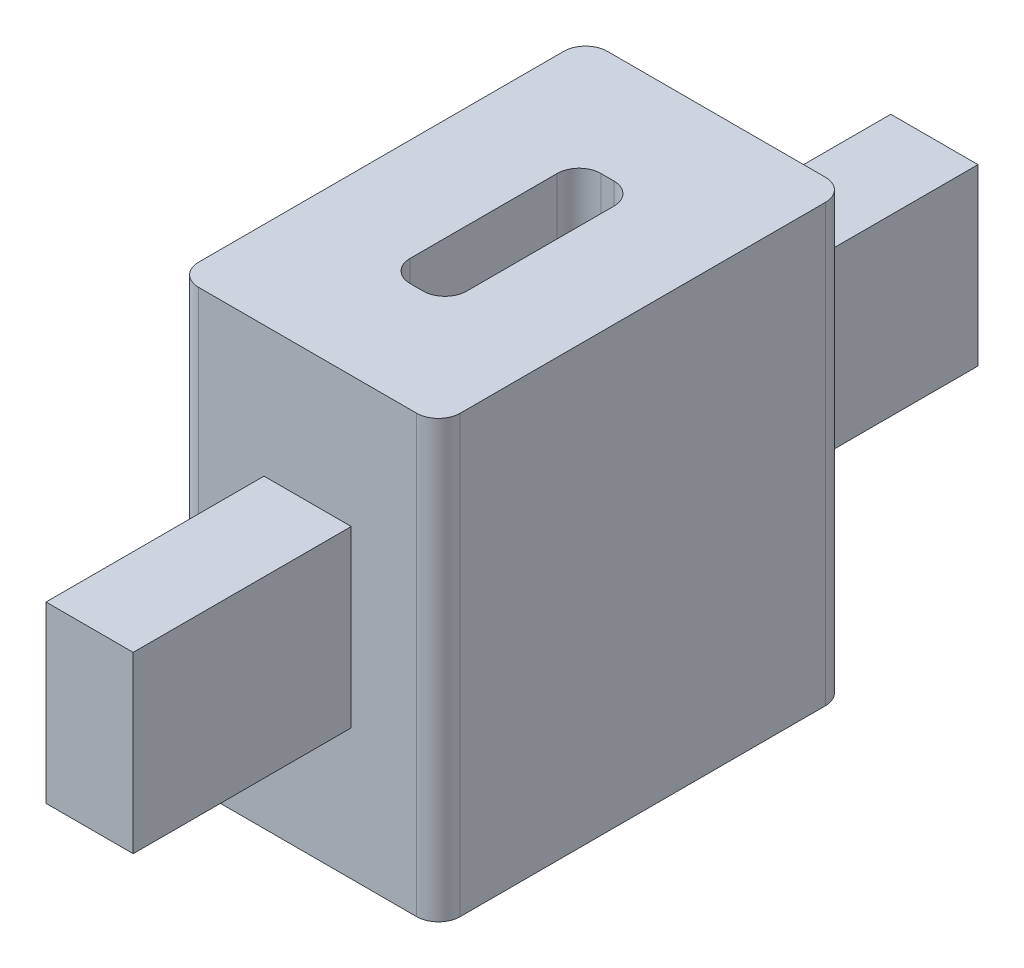
ISO-10303-21;
HEADER;
FILE_DESCRIPTION(('STEP AP214'),'2;1');
FILE_NAME('part.step','',(''),(''),'','','');
FILE_SCHEMA(('AUTOMOTIVE_DESIGN { 1 0 10303 214 1 1 1 1 }'));
ENDSEC;
DATA;
#1=APPLICATION_CONTEXT('core data for automotive mechanical design processes');
#2=APPLICATION_PROTOCOL_DEFINITION('international standard','automotive_design',2000,#1);
#3=PRODUCT_CONTEXT('',#1,'mechanical');
#4=PRODUCT('Part','Part','',(#3));
#5=PRODUCT_RELATED_PRODUCT_CATEGORY('part','',(#4));
#6=PRODUCT_DEFINITION_FORMATION('','',#4);
#7=PRODUCT_DEFINITION_CONTEXT('part definition',#1,'design');
#8=PRODUCT_DEFINITION('design','',#6,#7);
#9=PRODUCT_DEFINITION_SHAPE('','',#8);
#10=(LENGTH_UNIT() NAMED_UNIT(*) SI_UNIT(.MILLI.,.METRE.));
#11=(NAMED_UNIT(*) PLANE_ANGLE_UNIT() SI_UNIT($,.RADIAN.));
#12=(NAMED_UNIT(*) SI_UNIT($,.STERADIAN.) SOLID_ANGLE_UNIT());
#13=UNCERTAINTY_MEASURE_WITH_UNIT(LENGTH_MEASURE(1.E-05),#10,'distance_accuracy_value','');
#14=(GEOMETRIC_REPRESENTATION_CONTEXT(3) GLOBAL_UNCERTAINTY_ASSIGNED_CONTEXT((#13)) GLOBAL_UNIT_ASSIGNED_CONTEXT((#10,
#11,#12)) REPRESENTATION_CONTEXT('',''));
#15=CARTESIAN_POINT('',(0.,0.,0.));
#16=DIRECTION('',(0.,0.,1.));
#17=DIRECTION('',(1.,0.,0.));
#18=AXIS2_PLACEMENT_3D('',#15,#16,#17);
#19=CARTESIAN_POINT('',(-15.24,50.8,23.8125));
#20=DIRECTION('',(0.,0.,-1.));
#21=DIRECTION('',(-1.,0.,0.));
#22=AXIS2_PLACEMENT_3D('',#19,#20,#21);
#23=PLANE('',#22);
#24=DIRECTION('',(1.,0.,0.));
#25=VECTOR('',#24,1.);
#26=CARTESIAN_POINT('',(-15.24,0.,23.8125));
#27=LINE('',#26,#25);
#28=CARTESIAN_POINT('',(-12.7,0.,23.8125));
#29=VERTEX_POINT('',#28);
#30=CARTESIAN_POINT('',(12.7,0.,23.8125));
#31=VERTEX_POINT('',#30);
#32=EDGE_CURVE('E282',#29,#31,#27,.T.);
#33=ORIENTED_EDGE('',*,*,#32,.T.);
#34=DIRECTION('',(0.,-1.,0.));
#35=VECTOR('',#34,1.);
#36=CARTESIAN_POINT('',(12.7,50.8,23.8125));
#37=LINE('',#36,#35);
#38=CARTESIAN_POINT('',(12.7,50.8,23.8125));
#39=VERTEX_POINT('',#38);
#40=EDGE_CURVE('E353',#31,#39,#37,.F.);
#41=ORIENTED_EDGE('',*,*,#40,.T.);
#42=DIRECTION('',(1.,0.,0.));
#43=VECTOR('',#42,1.);
#44=CARTESIAN_POINT('',(-15.24,50.8,23.8125));
#45=LINE('',#44,#43);
#46=CARTESIAN_POINT('',(-12.7,50.8,23.8125));
#47=VERTEX_POINT('',#46);
#48=EDGE_CURVE('E288',#47,#39,#45,.T.);
#49=ORIENTED_EDGE('',*,*,#48,.F.);
#50=DIRECTION('',(0.,-1.,0.));
#51=VECTOR('',#50,1.);
#52=CARTESIAN_POINT('',(-12.7,50.8,23.8125));
#53=LINE('',#52,#51);
#54=EDGE_CURVE('E350',#47,#29,#53,.T.);
#55=ORIENTED_EDGE('',*,*,#54,.T.);
#56=EDGE_LOOP('',(#33,#41,#49,#55));
#57=FACE_BOUND('',#56,.T.);
#58=DIRECTION('',(0.,1.,0.));
#59=VECTOR('',#58,1.);
#60=CARTESIAN_POINT('',(5.08,35.56,23.8125));
#61=LINE('',#60,#59);
#62=CARTESIAN_POINT('',(5.08,15.24,23.8125));
#63=VERTEX_POINT('',#62);
#64=CARTESIAN_POINT('',(5.08,35.56,23.8125));
#65=VERTEX_POINT('',#64);
#66=EDGE_CURVE('E215',#63,#65,#61,.T.);
#67=ORIENTED_EDGE('',*,*,#66,.F.);
#68=DIRECTION('',(1.,0.,0.));
#69=VECTOR('',#68,1.);
#70=CARTESIAN_POINT('',(-5.08,15.24,23.8125));
#71=LINE('',#70,#69);
#72=CARTESIAN_POINT('',(-5.08,15.24,23.8125));
#73=VERTEX_POINT('',#72);
#74=EDGE_CURVE('E212',#73,#63,#71,.T.);
#75=ORIENTED_EDGE('',*,*,#74,.F.);
#76=DIRECTION('',(0.,-1.,0.));
#77=VECTOR('',#76,1.);
#78=CARTESIAN_POINT('',(-5.08,35.56,23.8125));
#79=LINE('',#78,#77);
#80=CARTESIAN_POINT('',(-5.08,35.56,23.8125));
#81=VERTEX_POINT('',#80);
#82=EDGE_CURVE('E55',#81,#73,#79,.T.);
#83=ORIENTED_EDGE('',*,*,#82,.F.);
#84=DIRECTION('',(-1.,0.,0.));
#85=VECTOR('',#84,1.);
#86=CARTESIAN_POINT('',(-5.08,35.56,23.8125));
#87=LINE('',#86,#85);
#88=EDGE_CURVE('E50',#65,#81,#87,.T.);
#89=ORIENTED_EDGE('',*,*,#88,.F.);
#90=EDGE_LOOP('',(#67,#75,#83,#89));
#91=FACE_BOUND('',#90,.T.);
#92=ADVANCED_FACE('F35',(#57,#91),#23,.F.);
#93=CARTESIAN_POINT('',(0.,50.8,0.));
#94=DIRECTION('',(0.,-1.,0.));
#95=DIRECTION('',(0.,0.,-1.));
#96=AXIS2_PLACEMENT_3D('',#93,#94,#95);
#97=PLANE('',#96);
#98=ORIENTED_EDGE('',*,*,#48,.T.);
#99=CARTESIAN_POINT('',(12.7,50.8,21.2725));
#100=DIRECTION('',(0.,-1.,0.));
#101=DIRECTION('',(0.,0.,-1.));
#102=AXIS2_PLACEMENT_3D('',#99,#100,#101);
#103=CIRCLE('',#102,2.54);
#104=CARTESIAN_POINT('',(15.24,50.8,21.2725));
#105=VERTEX_POINT('',#104);
#106=EDGE_CURVE('E361',#39,#105,#103,.F.);
#107=ORIENTED_EDGE('',*,*,#106,.T.);
#108=DIRECTION('',(0.,0.,-1.));
#109=VECTOR('',#108,1.);
#110=CARTESIAN_POINT('',(15.24,50.8,23.8125));
#111=LINE('',#110,#109);
#112=CARTESIAN_POINT('',(15.24,50.8,-21.2725));
#113=VERTEX_POINT('',#112);
#114=EDGE_CURVE('E278',#105,#113,#111,.T.);
#115=ORIENTED_EDGE('',*,*,#114,.T.);
#116=CARTESIAN_POINT('',(12.7,50.8,-21.2725));
#117=DIRECTION('',(0.,-1.,0.));
#118=DIRECTION('',(0.,0.,-1.));
#119=AXIS2_PLACEMENT_3D('',#116,#117,#118);
#120=CIRCLE('',#119,2.54);
#121=CARTESIAN_POINT('',(12.7,50.8,-23.8125));
#122=VERTEX_POINT('',#121);
#123=EDGE_CURVE('E359',#113,#122,#120,.F.);
#124=ORIENTED_EDGE('',*,*,#123,.T.);
#125=DIRECTION('',(-1.,0.,0.));
#126=VECTOR('',#125,1.);
#127=CARTESIAN_POINT('',(-15.24,50.8,-23.8125));
#128=LINE('',#127,#126);
#129=CARTESIAN_POINT('',(-12.7,50.8,-23.8125));
#130=VERTEX_POINT('',#129);
#131=EDGE_CURVE('E281',#122,#130,#128,.T.);
#132=ORIENTED_EDGE('',*,*,#131,.T.);
#133=CARTESIAN_POINT('',(-12.7,50.8,-21.2725));
#134=DIRECTION('',(0.,-1.,0.));
#135=DIRECTION('',(0.,0.,-1.));
#136=AXIS2_PLACEMENT_3D('',#133,#134,#135);
#137=CIRCLE('',#136,2.54);
#138=CARTESIAN_POINT('',(-15.24,50.8,-21.2725));
#139=VERTEX_POINT('',#138);
#140=EDGE_CURVE('E355',#130,#139,#137,.F.);
#141=ORIENTED_EDGE('',*,*,#140,.T.);
#142=DIRECTION('',(0.,0.,1.));
#143=VECTOR('',#142,1.);
#144=CARTESIAN_POINT('',(-15.24,50.8,23.8125));
#145=LINE('',#144,#143);
#146=CARTESIAN_POINT('',(-15.24,50.8,21.2725));
#147=VERTEX_POINT('',#146);
#148=EDGE_CURVE('E285',#139,#147,#145,.T.);
#149=ORIENTED_EDGE('',*,*,#148,.T.);
#150=CARTESIAN_POINT('',(-12.7,50.8,21.2725));
#151=DIRECTION('',(0.,-1.,0.));
#152=DIRECTION('',(0.,0.,-1.));
#153=AXIS2_PLACEMENT_3D('',#150,#151,#152);
#154=CIRCLE('',#153,2.54);
#155=EDGE_CURVE('E357',#147,#47,#154,.F.);
#156=ORIENTED_EDGE('',*,*,#155,.T.);
#157=EDGE_LOOP('',(#98,#107,#115,#124,#132,#141,#149,#156));
#158=FACE_BOUND('',#157,.T.);
#159=DIRECTION('',(-1.,0.,0.));
#160=VECTOR('',#159,1.);
#161=CARTESIAN_POINT('',(0.,50.8,11.1125));
#162=LINE('',#161,#160);
#163=CARTESIAN_POINT('',(0.761999999999999,50.8,11.1125));
#164=VERTEX_POINT('',#163);
#165=CARTESIAN_POINT('',(-0.762000000000001,50.8,11.1125));
#166=VERTEX_POINT('',#165);
#167=EDGE_CURVE('E270',#164,#166,#162,.T.);
#168=ORIENTED_EDGE('',*,*,#167,.T.);
#169=CARTESIAN_POINT('',(-0.762000000000001,50.8,8.5725));
#170=DIRECTION('',(0.,-1.,0.));
#171=DIRECTION('',(0.,0.,-1.));
#172=AXIS2_PLACEMENT_3D('',#169,#170,#171);
#173=CIRCLE('',#172,2.54);
#174=CARTESIAN_POINT('',(-3.302,50.8,8.5725));
#175=VERTEX_POINT('',#174);
#176=EDGE_CURVE('E321',#166,#175,#173,.T.);
#177=ORIENTED_EDGE('',*,*,#176,.T.);
#178=DIRECTION('',(0.,0.,-1.));
#179=VECTOR('',#178,1.);
#180=CARTESIAN_POINT('',(-3.302,50.8,0.));
#181=LINE('',#180,#179);
#182=CARTESIAN_POINT('',(-3.302,50.8,-8.5725));
#183=VERTEX_POINT('',#182);
#184=EDGE_CURVE('E253',#175,#183,#181,.T.);
#185=ORIENTED_EDGE('',*,*,#184,.T.);
#186=CARTESIAN_POINT('',(-0.762000000000001,50.8,-8.5725));
#187=DIRECTION('',(0.,-1.,0.));
#188=DIRECTION('',(0.,0.,-1.));
#189=AXIS2_PLACEMENT_3D('',#186,#187,#188);
#190=CIRCLE('',#189,2.54);
#191=CARTESIAN_POINT('',(-0.762000000000001,50.8,-11.1125));
#192=VERTEX_POINT('',#191);
#193=EDGE_CURVE('E333',#183,#192,#190,.T.);
#194=ORIENTED_EDGE('',*,*,#193,.T.);
#195=DIRECTION('',(-1.,0.,0.));
#196=VECTOR('',#195,1.);
#197=CARTESIAN_POINT('',(0.,50.8,-11.1125));
#198=LINE('',#197,#196);
#199=CARTESIAN_POINT('',(0.761999999999999,50.8,-11.1125));
#200=VERTEX_POINT('',#199);
#201=EDGE_CURVE('E258',#200,#192,#198,.T.);
#202=ORIENTED_EDGE('',*,*,#201,.F.);
#203=CARTESIAN_POINT('',(0.761999999999999,50.8,-8.5725));
#204=DIRECTION('',(0.,-1.,0.));
#205=DIRECTION('',(0.,0.,-1.));
#206=AXIS2_PLACEMENT_3D('',#203,#204,#205);
#207=CIRCLE('',#206,2.54);
#208=CARTESIAN_POINT('',(3.302,50.8,-8.5725));
#209=VERTEX_POINT('',#208);
#210=EDGE_CURVE('E325',#200,#209,#207,.T.);
#211=ORIENTED_EDGE('',*,*,#210,.T.);
#212=DIRECTION('',(0.,0.,1.));
#213=VECTOR('',#212,1.);
#214=CARTESIAN_POINT('',(3.302,50.8,0.));
#215=LINE('',#214,#213);
#216=CARTESIAN_POINT('',(3.302,50.8,8.5725));
#217=VERTEX_POINT('',#216);
#218=EDGE_CURVE('E273',#209,#217,#215,.T.);
#219=ORIENTED_EDGE('',*,*,#218,.T.);
#220=CARTESIAN_POINT('',(0.761999999999999,50.8,8.5725));
#221=DIRECTION('',(0.,-1.,0.));
#222=DIRECTION('',(0.,0.,-1.));
#223=AXIS2_PLACEMENT_3D('',#220,#221,#222);
#224=CIRCLE('',#223,2.54);
#225=EDGE_CURVE('E329',#217,#164,#224,.T.);
#226=ORIENTED_EDGE('',*,*,#225,.T.);
#227=EDGE_LOOP('',(#168,#177,#185,#194,#202,#211,#219,#226));
#228=FACE_BOUND('',#227,.T.);
#229=ADVANCED_FACE('F391',(#158,#228),#97,.F.);
#230=CARTESIAN_POINT('',(0.,0.,0.));
#231=DIRECTION('',(0.,-1.,0.));
#232=DIRECTION('',(0.,0.,-1.));
#233=AXIS2_PLACEMENT_3D('',#230,#231,#232);
#234=PLANE('',#233);
#235=DIRECTION('',(0.,0.,-1.));
#236=VECTOR('',#235,1.);
#237=CARTESIAN_POINT('',(15.24,0.,23.8125));
#238=LINE('',#237,#236);
#239=CARTESIAN_POINT('',(15.24,0.,21.2725));
#240=VERTEX_POINT('',#239);
#241=CARTESIAN_POINT('',(15.24,0.,-21.2725));
#242=VERTEX_POINT('',#241);
#243=EDGE_CURVE('E267',#240,#242,#238,.T.);
#244=ORIENTED_EDGE('',*,*,#243,.F.);
#245=CARTESIAN_POINT('',(12.7,0.,21.2725));
#246=DIRECTION('',(0.,-1.,0.));
#247=DIRECTION('',(0.,0.,-1.));
#248=AXIS2_PLACEMENT_3D('',#245,#246,#247);
#249=CIRCLE('',#248,2.54);
#250=EDGE_CURVE('E348',#240,#31,#249,.T.);
#251=ORIENTED_EDGE('',*,*,#250,.T.);
#252=ORIENTED_EDGE('',*,*,#32,.F.);
#253=CARTESIAN_POINT('',(-12.7,0.,21.2725));
#254=DIRECTION('',(0.,-1.,0.));
#255=DIRECTION('',(0.,0.,-1.));
#256=AXIS2_PLACEMENT_3D('',#253,#254,#255);
#257=CIRCLE('',#256,2.54);
#258=CARTESIAN_POINT('',(-15.24,0.,21.2725));
#259=VERTEX_POINT('',#258);
#260=EDGE_CURVE('E344',#29,#259,#257,.T.);
#261=ORIENTED_EDGE('',*,*,#260,.T.);
#262=DIRECTION('',(0.,0.,1.));
#263=VECTOR('',#262,1.);
#264=CARTESIAN_POINT('',(-15.24,0.,23.8125));
#265=LINE('',#264,#263);
#266=CARTESIAN_POINT('',(-15.24,0.,-21.2725));
#267=VERTEX_POINT('',#266);
#268=EDGE_CURVE('E297',#267,#259,#265,.T.);
#269=ORIENTED_EDGE('',*,*,#268,.F.);
#270=CARTESIAN_POINT('',(-12.7,0.,-21.2725));
#271=DIRECTION('',(0.,-1.,0.));
#272=DIRECTION('',(0.,0.,-1.));
#273=AXIS2_PLACEMENT_3D('',#270,#271,#272);
#274=CIRCLE('',#273,2.54);
#275=CARTESIAN_POINT('',(-12.7,0.,-23.8125));
#276=VERTEX_POINT('',#275);
#277=EDGE_CURVE('E342',#267,#276,#274,.T.);
#278=ORIENTED_EDGE('',*,*,#277,.T.);
#279=DIRECTION('',(-1.,0.,0.));
#280=VECTOR('',#279,1.);
#281=CARTESIAN_POINT('',(-15.24,0.,-23.8125));
#282=LINE('',#281,#280);
#283=CARTESIAN_POINT('',(12.7,0.,-23.8125));
#284=VERTEX_POINT('',#283);
#285=EDGE_CURVE('E294',#284,#276,#282,.T.);
#286=ORIENTED_EDGE('',*,*,#285,.F.);
#287=CARTESIAN_POINT('',(12.7,0.,-21.2725));
#288=DIRECTION('',(0.,-1.,0.));
#289=DIRECTION('',(0.,0.,-1.));
#290=AXIS2_PLACEMENT_3D('',#287,#288,#289);
#291=CIRCLE('',#290,2.54);
#292=EDGE_CURVE('E346',#284,#242,#291,.T.);
#293=ORIENTED_EDGE('',*,*,#292,.T.);
#294=EDGE_LOOP('',(#244,#251,#252,#261,#269,#278,#286,#293));
#295=FACE_BOUND('',#294,.T.);
#296=DIRECTION('',(0.,0.,1.));
#297=VECTOR('',#296,1.);
#298=CARTESIAN_POINT('',(3.302,0.,0.));
#299=LINE('',#298,#297);
#300=CARTESIAN_POINT('',(3.302,0.,-8.5725));
#301=VERTEX_POINT('',#300);
#302=CARTESIAN_POINT('',(3.302,0.,8.5725));
#303=VERTEX_POINT('',#302);
#304=EDGE_CURVE('E261',#301,#303,#299,.T.);
#305=ORIENTED_EDGE('',*,*,#304,.F.);
#306=CARTESIAN_POINT('',(0.761999999999999,0.,-8.5725));
#307=DIRECTION('',(0.,-1.,0.));
#308=DIRECTION('',(0.,0.,-1.));
#309=AXIS2_PLACEMENT_3D('',#306,#307,#308);
#310=CIRCLE('',#309,2.54);
#311=CARTESIAN_POINT('',(0.761999999999999,0.,-11.1125));
#312=VERTEX_POINT('',#311);
#313=EDGE_CURVE('E327',#301,#312,#310,.F.);
#314=ORIENTED_EDGE('',*,*,#313,.T.);
#315=DIRECTION('',(-1.,0.,0.));
#316=VECTOR('',#315,1.);
#317=CARTESIAN_POINT('',(0.,0.,-11.1125));
#318=LINE('',#317,#316);
#319=CARTESIAN_POINT('',(-0.762000000000001,0.,-11.1125));
#320=VERTEX_POINT('',#319);
#321=EDGE_CURVE('E264',#312,#320,#318,.T.);
#322=ORIENTED_EDGE('',*,*,#321,.T.);
#323=CARTESIAN_POINT('',(-0.762000000000001,0.,-8.5725));
#324=DIRECTION('',(0.,-1.,0.));
#325=DIRECTION('',(0.,0.,-1.));
#326=AXIS2_PLACEMENT_3D('',#323,#324,#325);
#327=CIRCLE('',#326,2.54);
#328=CARTESIAN_POINT('',(-3.302,0.,-8.5725));
#329=VERTEX_POINT('',#328);
#330=EDGE_CURVE('E335',#320,#329,#327,.F.);
#331=ORIENTED_EDGE('',*,*,#330,.T.);
#332=DIRECTION('',(0.,0.,-1.));
#333=VECTOR('',#332,1.);
#334=CARTESIAN_POINT('',(-3.302,0.,0.));
#335=LINE('',#334,#333);
#336=CARTESIAN_POINT('',(-3.302,0.,8.5725));
#337=VERTEX_POINT('',#336);
#338=EDGE_CURVE('E254',#337,#329,#335,.T.);
#339=ORIENTED_EDGE('',*,*,#338,.F.);
#340=CARTESIAN_POINT('',(-0.762000000000001,0.,8.5725));
#341=DIRECTION('',(0.,-1.,0.));
#342=DIRECTION('',(0.,0.,-1.));
#343=AXIS2_PLACEMENT_3D('',#340,#341,#342);
#344=CIRCLE('',#343,2.54);
#345=CARTESIAN_POINT('',(-0.762000000000001,0.,11.1125));
#346=VERTEX_POINT('',#345);
#347=EDGE_CURVE('E323',#337,#346,#344,.F.);
#348=ORIENTED_EDGE('',*,*,#347,.T.);
#349=DIRECTION('',(-1.,0.,0.));
#350=VECTOR('',#349,1.);
#351=CARTESIAN_POINT('',(0.,0.,11.1125));
#352=LINE('',#351,#350);
#353=CARTESIAN_POINT('',(0.761999999999999,0.,11.1125));
#354=VERTEX_POINT('',#353);
#355=EDGE_CURVE('E257',#354,#346,#352,.T.);
#356=ORIENTED_EDGE('',*,*,#355,.F.);
#357=CARTESIAN_POINT('',(0.761999999999999,0.,8.5725));
#358=DIRECTION('',(0.,-1.,0.));
#359=DIRECTION('',(0.,0.,-1.));
#360=AXIS2_PLACEMENT_3D('',#357,#358,#359);
#361=CIRCLE('',#360,2.54);
#362=EDGE_CURVE('E331',#354,#303,#361,.F.);
#363=ORIENTED_EDGE('',*,*,#362,.T.);
#364=EDGE_LOOP('',(#305,#314,#322,#331,#339,#348,#356,#363));
#365=FACE_BOUND('',#364,.T.);
#366=ADVANCED_FACE('F378',(#295,#365),#234,.T.);
#367=CARTESIAN_POINT('',(15.24,50.8,23.8125));
#368=DIRECTION('',(-1.,0.,0.));
#369=DIRECTION('',(0.,0.,1.));
#370=AXIS2_PLACEMENT_3D('',#367,#368,#369);
#371=PLANE('',#370);
#372=ORIENTED_EDGE('',*,*,#114,.F.);
#373=DIRECTION('',(0.,-1.,0.));
#374=VECTOR('',#373,1.);
#375=CARTESIAN_POINT('',(15.24,50.8,21.2725));
#376=LINE('',#375,#374);
#377=EDGE_CURVE('E339',#105,#240,#376,.T.);
#378=ORIENTED_EDGE('',*,*,#377,.T.);
#379=ORIENTED_EDGE('',*,*,#243,.T.);
#380=DIRECTION('',(0.,-1.,0.));
#381=VECTOR('',#380,1.);
#382=CARTESIAN_POINT('',(15.24,50.8,-21.2725));
#383=LINE('',#382,#381);
#384=EDGE_CURVE('E337',#242,#113,#383,.F.);
#385=ORIENTED_EDGE('',*,*,#384,.T.);
#386=EDGE_LOOP('',(#372,#378,#379,#385));
#387=FACE_BOUND('',#386,.T.);
#388=ADVANCED_FACE('F398',(#387),#371,.F.);
#389=CARTESIAN_POINT('',(-15.24,50.8,-23.8125));
#390=DIRECTION('',(0.,0.,1.));
#391=DIRECTION('',(1.,0.,0.));
#392=AXIS2_PLACEMENT_3D('',#389,#390,#391);
#393=PLANE('',#392);
#394=DIRECTION('',(1.,0.,0.));
#395=VECTOR('',#394,1.);
#396=CARTESIAN_POINT('',(0.,15.2388435010998,-23.8125));
#397=LINE('',#396,#395);
#398=CARTESIAN_POINT('',(-5.08057824945011,15.2388435010998,-23.8125));
#399=VERTEX_POINT('',#398);
#400=CARTESIAN_POINT('',(5.08057824945011,15.2388435010998,-23.8125));
#401=VERTEX_POINT('',#400);
#402=EDGE_CURVE('E218',#399,#401,#397,.T.);
#403=ORIENTED_EDGE('',*,*,#402,.T.);
#404=DIRECTION('',(0.,1.,0.));
#405=VECTOR('',#404,1.);
#406=CARTESIAN_POINT('',(5.08057824945011,0.,-23.8125));
#407=LINE('',#406,#405);
#408=CARTESIAN_POINT('',(5.08057824945011,35.5611564989002,-23.8125));
#409=VERTEX_POINT('',#408);
#410=EDGE_CURVE('E216',#401,#409,#407,.T.);
#411=ORIENTED_EDGE('',*,*,#410,.T.);
#412=DIRECTION('',(1.,0.,0.));
#413=VECTOR('',#412,1.);
#414=CARTESIAN_POINT('',(0.,35.5611564989002,-23.8125));
#415=LINE('',#414,#413);
#416=CARTESIAN_POINT('',(-5.0805782494501,35.5611564989002,-23.8125));
#417=VERTEX_POINT('',#416);
#418=EDGE_CURVE('E228',#417,#409,#415,.T.);
#419=ORIENTED_EDGE('',*,*,#418,.F.);
#420=DIRECTION('',(0.,1.,0.));
#421=VECTOR('',#420,1.);
#422=CARTESIAN_POINT('',(-5.08057824945011,0.,-23.8125));
#423=LINE('',#422,#421);
#424=EDGE_CURVE('E237',#399,#417,#423,.T.);
#425=ORIENTED_EDGE('',*,*,#424,.F.);
#426=EDGE_LOOP('',(#403,#411,#419,#425));
#427=FACE_BOUND('',#426,.T.);
#428=ORIENTED_EDGE('',*,*,#131,.F.);
#429=DIRECTION('',(0.,-1.,0.));
#430=VECTOR('',#429,1.);
#431=CARTESIAN_POINT('',(12.7,50.8,-23.8125));
#432=LINE('',#431,#430);
#433=EDGE_CURVE('E365',#122,#284,#432,.T.);
#434=ORIENTED_EDGE('',*,*,#433,.T.);
#435=ORIENTED_EDGE('',*,*,#285,.T.);
#436=DIRECTION('',(0.,-1.,0.));
#437=VECTOR('',#436,1.);
#438=CARTESIAN_POINT('',(-12.7,50.8,-23.8125));
#439=LINE('',#438,#437);
#440=EDGE_CURVE('E363',#276,#130,#439,.F.);
#441=ORIENTED_EDGE('',*,*,#440,.T.);
#442=EDGE_LOOP('',(#428,#434,#435,#441));
#443=FACE_BOUND('',#442,.T.);
#444=ADVANCED_FACE('F406',(#427,#443),#393,.F.);
#445=CARTESIAN_POINT('',(-15.24,50.8,23.8125));
#446=DIRECTION('',(1.,0.,0.));
#447=DIRECTION('',(0.,0.,-1.));
#448=AXIS2_PLACEMENT_3D('',#445,#446,#447);
#449=PLANE('',#448);
#450=ORIENTED_EDGE('',*,*,#268,.T.);
#451=DIRECTION('',(0.,-1.,0.));
#452=VECTOR('',#451,1.);
#453=CARTESIAN_POINT('',(-15.24,50.8,21.2725));
#454=LINE('',#453,#452);
#455=EDGE_CURVE('E11',#259,#147,#454,.F.);
#456=ORIENTED_EDGE('',*,*,#455,.T.);
#457=ORIENTED_EDGE('',*,*,#148,.F.);
#458=DIRECTION('',(0.,-1.,0.));
#459=VECTOR('',#458,1.);
#460=CARTESIAN_POINT('',(-15.24,50.8,-21.2725));
#461=LINE('',#460,#459);
#462=EDGE_CURVE('E43',#139,#267,#461,.T.);
#463=ORIENTED_EDGE('',*,*,#462,.T.);
#464=EDGE_LOOP('',(#450,#456,#457,#463));
#465=FACE_BOUND('',#464,.T.);
#466=ADVANCED_FACE('F372',(#465),#449,.F.);
#467=CARTESIAN_POINT('',(-3.302,0.,0.));
#468=DIRECTION('',(1.,0.,0.));
#469=DIRECTION('',(0.,0.,-1.));
#470=AXIS2_PLACEMENT_3D('',#467,#468,#469);
#471=PLANE('',#470);
#472=ORIENTED_EDGE('',*,*,#184,.F.);
#473=DIRECTION('',(0.,1.,0.));
#474=VECTOR('',#473,1.);
#475=CARTESIAN_POINT('',(-3.302,0.,8.5725));
#476=LINE('',#475,#474);
#477=EDGE_CURVE('E309',#175,#337,#476,.F.);
#478=ORIENTED_EDGE('',*,*,#477,.T.);
#479=ORIENTED_EDGE('',*,*,#338,.T.);
#480=DIRECTION('',(0.,1.,0.));
#481=VECTOR('',#480,1.);
#482=CARTESIAN_POINT('',(-3.302,0.,-8.5725));
#483=LINE('',#482,#481);
#484=EDGE_CURVE('E306',#329,#183,#483,.T.);
#485=ORIENTED_EDGE('',*,*,#484,.T.);
#486=EDGE_LOOP('',(#472,#478,#479,#485));
#487=FACE_BOUND('',#486,.T.);
#488=ADVANCED_FACE('F430',(#487),#471,.T.);
#489=CARTESIAN_POINT('',(0.,0.,-11.1125));
#490=DIRECTION('',(0.,0.,-1.));
#491=DIRECTION('',(-1.,0.,0.));
#492=AXIS2_PLACEMENT_3D('',#489,#490,#491);
#493=PLANE('',#492);
#494=ORIENTED_EDGE('',*,*,#321,.F.);
#495=DIRECTION('',(0.,1.,0.));
#496=VECTOR('',#495,1.);
#497=CARTESIAN_POINT('',(0.761999999999999,0.,-11.1125));
#498=LINE('',#497,#496);
#499=EDGE_CURVE('E313',#312,#200,#498,.T.);
#500=ORIENTED_EDGE('',*,*,#499,.T.);
#501=ORIENTED_EDGE('',*,*,#201,.T.);
#502=DIRECTION('',(0.,1.,0.));
#503=VECTOR('',#502,1.);
#504=CARTESIAN_POINT('',(-0.762000000000001,0.,-11.1125));
#505=LINE('',#504,#503);
#506=EDGE_CURVE('E311',#192,#320,#505,.F.);
#507=ORIENTED_EDGE('',*,*,#506,.T.);
#508=EDGE_LOOP('',(#494,#500,#501,#507));
#509=FACE_BOUND('',#508,.T.);
#510=ADVANCED_FACE('F568',(#509),#493,.F.);
#511=CARTESIAN_POINT('',(3.302,0.,0.));
#512=DIRECTION('',(-1.,0.,0.));
#513=DIRECTION('',(0.,0.,1.));
#514=AXIS2_PLACEMENT_3D('',#511,#512,#513);
#515=PLANE('',#514);
#516=ORIENTED_EDGE('',*,*,#218,.F.);
#517=DIRECTION('',(0.,1.,0.));
#518=VECTOR('',#517,1.);
#519=CARTESIAN_POINT('',(3.302,0.,-8.5725));
#520=LINE('',#519,#518);
#521=EDGE_CURVE('E319',#209,#301,#520,.F.);
#522=ORIENTED_EDGE('',*,*,#521,.T.);
#523=ORIENTED_EDGE('',*,*,#304,.T.);
#524=DIRECTION('',(0.,1.,0.));
#525=VECTOR('',#524,1.);
#526=CARTESIAN_POINT('',(3.302,50.8,8.5725));
#527=LINE('',#526,#525);
#528=EDGE_CURVE('E316',#303,#217,#527,.T.);
#529=ORIENTED_EDGE('',*,*,#528,.T.);
#530=EDGE_LOOP('',(#516,#522,#523,#529));
#531=FACE_BOUND('',#530,.T.);
#532=ADVANCED_FACE('F571',(#531),#515,.T.);
#533=CARTESIAN_POINT('',(0.,0.,11.1125));
#534=DIRECTION('',(0.,0.,-1.));
#535=DIRECTION('',(-1.,0.,0.));
#536=AXIS2_PLACEMENT_3D('',#533,#534,#535);
#537=PLANE('',#536);
#538=ORIENTED_EDGE('',*,*,#355,.T.);
#539=DIRECTION('',(0.,1.,0.));
#540=VECTOR('',#539,1.);
#541=CARTESIAN_POINT('',(-0.762000000000001,50.8,11.1125));
#542=LINE('',#541,#540);
#543=EDGE_CURVE('E303',#346,#166,#542,.T.);
#544=ORIENTED_EDGE('',*,*,#543,.T.);
#545=ORIENTED_EDGE('',*,*,#167,.F.);
#546=DIRECTION('',(0.,1.,0.));
#547=VECTOR('',#546,1.);
#548=CARTESIAN_POINT('',(0.761999999999999,0.,11.1125));
#549=LINE('',#548,#547);
#550=EDGE_CURVE('E291',#164,#354,#549,.F.);
#551=ORIENTED_EDGE('',*,*,#550,.T.);
#552=EDGE_LOOP('',(#538,#544,#545,#551));
#553=FACE_BOUND('',#552,.T.);
#554=ADVANCED_FACE('F440',(#553),#537,.T.);
#555=CARTESIAN_POINT('',(-0.762000000000001,0.,8.5725));
#556=DIRECTION('',(0.,-1.,0.));
#557=DIRECTION('',(0.,0.,-1.));
#558=AXIS2_PLACEMENT_3D('',#555,#556,#557);
#559=CYLINDRICAL_SURFACE('',#558,2.54);
#560=ORIENTED_EDGE('',*,*,#347,.F.);
#561=ORIENTED_EDGE('',*,*,#477,.F.);
#562=ORIENTED_EDGE('',*,*,#176,.F.);
#563=ORIENTED_EDGE('',*,*,#543,.F.);
#564=EDGE_LOOP('',(#560,#561,#562,#563));
#565=FACE_BOUND('',#564,.T.);
#566=ADVANCED_FACE('F436',(#565),#559,.F.);
#567=CARTESIAN_POINT('',(0.761999999999999,0.,-8.5725));
#568=DIRECTION('',(0.,1.,0.));
#569=DIRECTION('',(0.,0.,1.));
#570=AXIS2_PLACEMENT_3D('',#567,#568,#569);
#571=CYLINDRICAL_SURFACE('',#570,2.54);
#572=ORIENTED_EDGE('',*,*,#313,.F.);
#573=ORIENTED_EDGE('',*,*,#521,.F.);
#574=ORIENTED_EDGE('',*,*,#210,.F.);
#575=ORIENTED_EDGE('',*,*,#499,.F.);
#576=EDGE_LOOP('',(#572,#573,#574,#575));
#577=FACE_BOUND('',#576,.T.);
#578=ADVANCED_FACE('F439',(#577),#571,.F.);
#579=CARTESIAN_POINT('',(0.761999999999999,0.,8.5725));
#580=DIRECTION('',(0.,-1.,0.));
#581=DIRECTION('',(0.,0.,-1.));
#582=AXIS2_PLACEMENT_3D('',#579,#580,#581);
#583=CYLINDRICAL_SURFACE('',#582,2.54);
#584=ORIENTED_EDGE('',*,*,#362,.F.);
#585=ORIENTED_EDGE('',*,*,#550,.F.);
#586=ORIENTED_EDGE('',*,*,#225,.F.);
#587=ORIENTED_EDGE('',*,*,#528,.F.);
#588=EDGE_LOOP('',(#584,#585,#586,#587));
#589=FACE_BOUND('',#588,.T.);
#590=ADVANCED_FACE('F444',(#589),#583,.F.);
#591=CARTESIAN_POINT('',(-0.762000000000001,0.,-8.5725));
#592=DIRECTION('',(0.,1.,0.));
#593=DIRECTION('',(0.,0.,1.));
#594=AXIS2_PLACEMENT_3D('',#591,#592,#593);
#595=CYLINDRICAL_SURFACE('',#594,2.54);
#596=ORIENTED_EDGE('',*,*,#330,.F.);
#597=ORIENTED_EDGE('',*,*,#506,.F.);
#598=ORIENTED_EDGE('',*,*,#193,.F.);
#599=ORIENTED_EDGE('',*,*,#484,.F.);
#600=EDGE_LOOP('',(#596,#597,#598,#599));
#601=FACE_BOUND('',#600,.T.);
#602=ADVANCED_FACE('F448',(#601),#595,.F.);
#603=CARTESIAN_POINT('',(12.7,50.8,21.2725));
#604=DIRECTION('',(0.,-1.,0.));
#605=DIRECTION('',(0.,0.,-1.));
#606=AXIS2_PLACEMENT_3D('',#603,#604,#605);
#607=CYLINDRICAL_SURFACE('',#606,2.54);
#608=ORIENTED_EDGE('',*,*,#106,.F.);
#609=ORIENTED_EDGE('',*,*,#40,.F.);
#610=ORIENTED_EDGE('',*,*,#250,.F.);
#611=ORIENTED_EDGE('',*,*,#377,.F.);
#612=EDGE_LOOP('',(#608,#609,#610,#611));
#613=FACE_BOUND('',#612,.T.);
#614=ADVANCED_FACE('F396',(#613),#607,.T.);
#615=CARTESIAN_POINT('',(12.7,50.8,-21.2725));
#616=DIRECTION('',(0.,-1.,0.));
#617=DIRECTION('',(0.,0.,-1.));
#618=AXIS2_PLACEMENT_3D('',#615,#616,#617);
#619=CYLINDRICAL_SURFACE('',#618,2.54);
#620=ORIENTED_EDGE('',*,*,#123,.F.);
#621=ORIENTED_EDGE('',*,*,#384,.F.);
#622=ORIENTED_EDGE('',*,*,#292,.F.);
#623=ORIENTED_EDGE('',*,*,#433,.F.);
#624=EDGE_LOOP('',(#620,#621,#622,#623));
#625=FACE_BOUND('',#624,.T.);
#626=ADVANCED_FACE('F403',(#625),#619,.T.);
#627=CARTESIAN_POINT('',(-12.7,50.8,21.2725));
#628=DIRECTION('',(0.,-1.,0.));
#629=DIRECTION('',(0.,0.,-1.));
#630=AXIS2_PLACEMENT_3D('',#627,#628,#629);
#631=CYLINDRICAL_SURFACE('',#630,2.54);
#632=ORIENTED_EDGE('',*,*,#155,.F.);
#633=ORIENTED_EDGE('',*,*,#455,.F.);
#634=ORIENTED_EDGE('',*,*,#260,.F.);
#635=ORIENTED_EDGE('',*,*,#54,.F.);
#636=EDGE_LOOP('',(#632,#633,#634,#635));
#637=FACE_BOUND('',#636,.T.);
#638=ADVANCED_FACE('F385',(#637),#631,.T.);
#639=CARTESIAN_POINT('',(-12.7,50.8,-21.2725));
#640=DIRECTION('',(0.,-1.,0.));
#641=DIRECTION('',(0.,0.,-1.));
#642=AXIS2_PLACEMENT_3D('',#639,#640,#641);
#643=CYLINDRICAL_SURFACE('',#642,2.54);
#644=ORIENTED_EDGE('',*,*,#140,.F.);
#645=ORIENTED_EDGE('',*,*,#440,.F.);
#646=ORIENTED_EDGE('',*,*,#277,.F.);
#647=ORIENTED_EDGE('',*,*,#462,.F.);
#648=EDGE_LOOP('',(#644,#645,#646,#647));
#649=FACE_BOUND('',#648,.T.);
#650=ADVANCED_FACE('F37',(#649),#643,.T.);
#651=CARTESIAN_POINT('',(5.08057824945011,0.,-49.2125));
#652=DIRECTION('',(1.,0.,0.));
#653=DIRECTION('',(0.,0.,-1.));
#654=AXIS2_PLACEMENT_3D('',#651,#652,#653);
#655=PLANE('',#654);
#656=ORIENTED_EDGE('',*,*,#410,.F.);
#657=DIRECTION('',(0.,0.,1.));
#658=VECTOR('',#657,1.);
#659=CARTESIAN_POINT('',(5.08057824945011,15.2388435010998,-49.2125));
#660=LINE('',#659,#658);
#661=CARTESIAN_POINT('',(5.08057824945011,15.2388435010998,-49.2125));
#662=VERTEX_POINT('',#661);
#663=EDGE_CURVE('E250',#662,#401,#660,.T.);
#664=ORIENTED_EDGE('',*,*,#663,.F.);
#665=DIRECTION('',(0.,1.,0.));
#666=VECTOR('',#665,1.);
#667=CARTESIAN_POINT('',(5.08057824945011,0.,-49.2125));
#668=LINE('',#667,#666);
#669=CARTESIAN_POINT('',(5.08057824945011,35.5611564989002,-49.2125));
#670=VERTEX_POINT('',#669);
#671=EDGE_CURVE('E224',#662,#670,#668,.T.);
#672=ORIENTED_EDGE('',*,*,#671,.T.);
#673=DIRECTION('',(0.,0.,1.));
#674=VECTOR('',#673,1.);
#675=CARTESIAN_POINT('',(5.08057824945011,35.5611564989002,-49.2125));
#676=LINE('',#675,#674);
#677=EDGE_CURVE('E234',#670,#409,#676,.T.);
#678=ORIENTED_EDGE('',*,*,#677,.T.);
#679=EDGE_LOOP('',(#656,#664,#672,#678));
#680=FACE_BOUND('',#679,.T.);
#681=ADVANCED_FACE('F409',(#680),#655,.T.);
#682=CARTESIAN_POINT('',(0.,15.2388435010998,-49.2125));
#683=DIRECTION('',(0.,-1.,0.));
#684=DIRECTION('',(0.,0.,-1.));
#685=AXIS2_PLACEMENT_3D('',#682,#683,#684);
#686=PLANE('',#685);
#687=ORIENTED_EDGE('',*,*,#402,.F.);
#688=DIRECTION('',(0.,0.,1.));
#689=VECTOR('',#688,1.);
#690=CARTESIAN_POINT('',(-5.08057824945011,15.2388435010998,-49.2125));
#691=LINE('',#690,#689);
#692=CARTESIAN_POINT('',(-5.08057824945011,15.2388435010998,-49.2125));
#693=VERTEX_POINT('',#692);
#694=EDGE_CURVE('E247',#693,#399,#691,.T.);
#695=ORIENTED_EDGE('',*,*,#694,.F.);
#696=DIRECTION('',(1.,0.,0.));
#697=VECTOR('',#696,1.);
#698=CARTESIAN_POINT('',(0.,15.2388435010998,-49.2125));
#699=LINE('',#698,#697);
#700=EDGE_CURVE('E227',#693,#662,#699,.T.);
#701=ORIENTED_EDGE('',*,*,#700,.T.);
#702=ORIENTED_EDGE('',*,*,#663,.T.);
#703=EDGE_LOOP('',(#687,#695,#701,#702));
#704=FACE_BOUND('',#703,.T.);
#705=ADVANCED_FACE('F415',(#704),#686,.T.);
#706=CARTESIAN_POINT('',(-5.08057824945011,0.,-49.2125));
#707=DIRECTION('',(1.,0.,0.));
#708=DIRECTION('',(0.,0.,-1.));
#709=AXIS2_PLACEMENT_3D('',#706,#707,#708);
#710=PLANE('',#709);
#711=ORIENTED_EDGE('',*,*,#424,.T.);
#712=DIRECTION('',(0.,0.,1.));
#713=VECTOR('',#712,1.);
#714=CARTESIAN_POINT('',(-5.0805782494501,35.5611564989002,-49.2125));
#715=LINE('',#714,#713);
#716=CARTESIAN_POINT('',(-5.0805782494501,35.5611564989002,-49.2125));
#717=VERTEX_POINT('',#716);
#718=EDGE_CURVE('E244',#717,#417,#715,.T.);
#719=ORIENTED_EDGE('',*,*,#718,.F.);
#720=DIRECTION('',(0.,1.,0.));
#721=VECTOR('',#720,1.);
#722=CARTESIAN_POINT('',(-5.08057824945011,0.,-49.2125));
#723=LINE('',#722,#721);
#724=EDGE_CURVE('E231',#693,#717,#723,.T.);
#725=ORIENTED_EDGE('',*,*,#724,.F.);
#726=ORIENTED_EDGE('',*,*,#694,.T.);
#727=EDGE_LOOP('',(#711,#719,#725,#726));
#728=FACE_BOUND('',#727,.T.);
#729=ADVANCED_FACE('F487',(#728),#710,.F.);
#730=CARTESIAN_POINT('',(0.,35.5611564989002,-49.2125));
#731=DIRECTION('',(0.,-1.,0.));
#732=DIRECTION('',(0.,0.,-1.));
#733=AXIS2_PLACEMENT_3D('',#730,#731,#732);
#734=PLANE('',#733);
#735=ORIENTED_EDGE('',*,*,#418,.T.);
#736=ORIENTED_EDGE('',*,*,#677,.F.);
#737=DIRECTION('',(1.,0.,0.));
#738=VECTOR('',#737,1.);
#739=CARTESIAN_POINT('',(0.,35.5611564989002,-49.2125));
#740=LINE('',#739,#738);
#741=EDGE_CURVE('E233',#717,#670,#740,.T.);
#742=ORIENTED_EDGE('',*,*,#741,.F.);
#743=ORIENTED_EDGE('',*,*,#718,.T.);
#744=EDGE_LOOP('',(#735,#736,#742,#743));
#745=FACE_BOUND('',#744,.T.);
#746=ADVANCED_FACE('F497',(#745),#734,.F.);
#747=CARTESIAN_POINT('',(0.,0.,-49.2125));
#748=DIRECTION('',(0.,0.,-1.));
#749=DIRECTION('',(-1.,0.,0.));
#750=AXIS2_PLACEMENT_3D('',#747,#748,#749);
#751=PLANE('',#750);
#752=ORIENTED_EDGE('',*,*,#671,.F.);
#753=ORIENTED_EDGE('',*,*,#700,.F.);
#754=ORIENTED_EDGE('',*,*,#724,.T.);
#755=ORIENTED_EDGE('',*,*,#741,.T.);
#756=EDGE_LOOP('',(#752,#753,#754,#755));
#757=FACE_BOUND('',#756,.T.);
#758=ADVANCED_FACE('F506',(#757),#751,.T.);
#759=CARTESIAN_POINT('',(5.08,35.56,49.2125));
#760=DIRECTION('',(-1.,0.,0.));
#761=DIRECTION('',(0.,-1.,0.));
#762=AXIS2_PLACEMENT_3D('',#759,#760,#761);
#763=PLANE('',#762);
#764=ORIENTED_EDGE('',*,*,#66,.T.);
#765=DIRECTION('',(0.,0.,-1.));
#766=VECTOR('',#765,1.);
#767=CARTESIAN_POINT('',(5.08,35.56,49.2125));
#768=LINE('',#767,#766);
#769=CARTESIAN_POINT('',(5.08,35.56,49.2125));
#770=VERTEX_POINT('',#769);
#771=EDGE_CURVE('E196',#770,#65,#768,.T.);
#772=ORIENTED_EDGE('',*,*,#771,.F.);
#773=DIRECTION('',(0.,1.,0.));
#774=VECTOR('',#773,1.);
#775=CARTESIAN_POINT('',(5.08,35.56,49.2125));
#776=LINE('',#775,#774);
#777=CARTESIAN_POINT('',(5.08,15.24,49.2125));
#778=VERTEX_POINT('',#777);
#779=EDGE_CURVE('E203',#778,#770,#776,.T.);
#780=ORIENTED_EDGE('',*,*,#779,.F.);
#781=DIRECTION('',(0.,0.,-1.));
#782=VECTOR('',#781,1.);
#783=CARTESIAN_POINT('',(5.08,15.24,49.2125));
#784=LINE('',#783,#782);
#785=EDGE_CURVE('E693',#778,#63,#784,.T.);
#786=ORIENTED_EDGE('',*,*,#785,.T.);
#787=EDGE_LOOP('',(#764,#772,#780,#786));
#788=FACE_BOUND('',#787,.T.);
#789=ADVANCED_FACE('F214',(#788),#763,.F.);
#790=CARTESIAN_POINT('',(-5.08,35.56,49.2125));
#791=DIRECTION('',(0.,-1.,0.));
#792=DIRECTION('',(0.,0.,-1.));
#793=AXIS2_PLACEMENT_3D('',#790,#791,#792);
#794=PLANE('',#793);
#795=ORIENTED_EDGE('',*,*,#88,.T.);
#796=DIRECTION('',(0.,0.,-1.));
#797=VECTOR('',#796,1.);
#798=CARTESIAN_POINT('',(-5.08,35.56,49.2125));
#799=LINE('',#798,#797);
#800=CARTESIAN_POINT('',(-5.08,35.56,49.2125));
#801=VERTEX_POINT('',#800);
#802=EDGE_CURVE('E199',#801,#81,#799,.T.);
#803=ORIENTED_EDGE('',*,*,#802,.F.);
#804=DIRECTION('',(-1.,0.,0.));
#805=VECTOR('',#804,1.);
#806=CARTESIAN_POINT('',(-5.08,35.56,49.2125));
#807=LINE('',#806,#805);
#808=EDGE_CURVE('E192',#770,#801,#807,.T.);
#809=ORIENTED_EDGE('',*,*,#808,.F.);
#810=ORIENTED_EDGE('',*,*,#771,.T.);
#811=EDGE_LOOP('',(#795,#803,#809,#810));
#812=FACE_BOUND('',#811,.T.);
#813=ADVANCED_FACE('F194',(#812),#794,.F.);
#814=CARTESIAN_POINT('',(-5.08,35.56,49.2125));
#815=DIRECTION('',(1.,0.,0.));
#816=DIRECTION('',(0.,1.,0.));
#817=AXIS2_PLACEMENT_3D('',#814,#815,#816);
#818=PLANE('',#817);
#819=ORIENTED_EDGE('',*,*,#82,.T.);
#820=DIRECTION('',(0.,0.,-1.));
#821=VECTOR('',#820,1.);
#822=CARTESIAN_POINT('',(-5.08,15.24,49.2125));
#823=LINE('',#822,#821);
#824=CARTESIAN_POINT('',(-5.08,15.24,49.2125));
#825=VERTEX_POINT('',#824);
#826=EDGE_CURVE('E220',#825,#73,#823,.T.);
#827=ORIENTED_EDGE('',*,*,#826,.F.);
#828=DIRECTION('',(0.,-1.,0.));
#829=VECTOR('',#828,1.);
#830=CARTESIAN_POINT('',(-5.08,35.56,49.2125));
#831=LINE('',#830,#829);
#832=EDGE_CURVE('E202',#801,#825,#831,.T.);
#833=ORIENTED_EDGE('',*,*,#832,.F.);
#834=ORIENTED_EDGE('',*,*,#802,.T.);
#835=EDGE_LOOP('',(#819,#827,#833,#834));
#836=FACE_BOUND('',#835,.T.);
#837=ADVANCED_FACE('F530',(#836),#818,.F.);
#838=CARTESIAN_POINT('',(-5.08,15.24,49.2125));
#839=DIRECTION('',(0.,1.,0.));
#840=DIRECTION('',(0.,0.,1.));
#841=AXIS2_PLACEMENT_3D('',#838,#839,#840);
#842=PLANE('',#841);
#843=ORIENTED_EDGE('',*,*,#74,.T.);
#844=ORIENTED_EDGE('',*,*,#785,.F.);
#845=DIRECTION('',(1.,0.,0.));
#846=VECTOR('',#845,1.);
#847=CARTESIAN_POINT('',(-5.08,15.24,49.2125));
#848=LINE('',#847,#846);
#849=EDGE_CURVE('E208',#825,#778,#848,.T.);
#850=ORIENTED_EDGE('',*,*,#849,.F.);
#851=ORIENTED_EDGE('',*,*,#826,.T.);
#852=EDGE_LOOP('',(#843,#844,#850,#851));
#853=FACE_BOUND('',#852,.T.);
#854=ADVANCED_FACE('F537',(#853),#842,.F.);
#855=CARTESIAN_POINT('',(0.,0.,49.2125));
#856=DIRECTION('',(0.,0.,1.));
#857=DIRECTION('',(1.,0.,0.));
#858=AXIS2_PLACEMENT_3D('',#855,#856,#857);
#859=PLANE('',#858);
#860=ORIENTED_EDGE('',*,*,#779,.T.);
#861=ORIENTED_EDGE('',*,*,#808,.T.);
#862=ORIENTED_EDGE('',*,*,#832,.T.);
#863=ORIENTED_EDGE('',*,*,#849,.T.);
#864=EDGE_LOOP('',(#860,#861,#862,#863));
#865=FACE_BOUND('',#864,.T.);
#866=ADVANCED_FACE('F206',(#865),#859,.T.);
#867=CLOSED_SHELL('',(#92,#229,#366,#388,#444,#466,#488,#510,#532,#554,#566,#578,#590,#602,#614,
#626,#638,#650,#681,#705,#729,#746,#758,#789,#813,#837,#854,#866));
#868=MANIFOLD_SOLID_BREP('B2',#867);
#869=ADVANCED_BREP_SHAPE_REPRESENTATION('',(#18,#868),#14);
#870=SHAPE_DEFINITION_REPRESENTATION(#9,#869);
ENDSEC;
END-ISO-10303-21;
